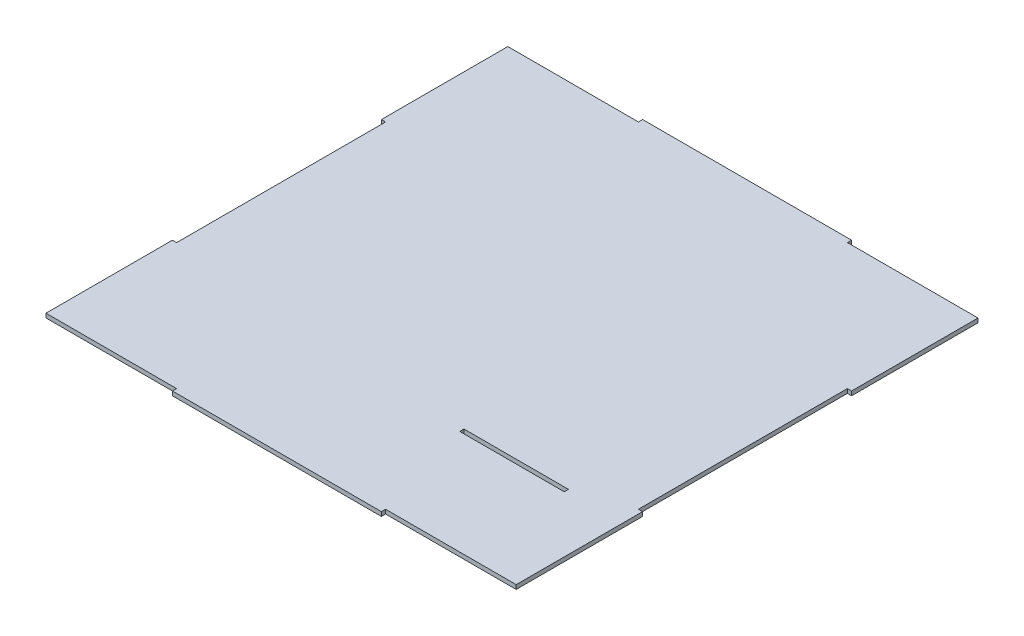
ISO-10303-21;
HEADER;
FILE_DESCRIPTION(('STEP AP214'),'2;1');
FILE_NAME('part.step','',(''),(''),'','','');
FILE_SCHEMA(('AUTOMOTIVE_DESIGN { 1 0 10303 214 1 1 1 1 }'));
ENDSEC;
DATA;
#1=APPLICATION_CONTEXT('core data for automotive mechanical design processes');
#2=APPLICATION_PROTOCOL_DEFINITION('international standard','automotive_design',2000,#1);
#3=PRODUCT_CONTEXT('',#1,'mechanical');
#4=PRODUCT('Part','Part','',(#3));
#5=PRODUCT_RELATED_PRODUCT_CATEGORY('part','',(#4));
#6=PRODUCT_DEFINITION_FORMATION('','',#4);
#7=PRODUCT_DEFINITION_CONTEXT('part definition',#1,'design');
#8=PRODUCT_DEFINITION('design','',#6,#7);
#9=PRODUCT_DEFINITION_SHAPE('','',#8);
#10=(LENGTH_UNIT() NAMED_UNIT(*) SI_UNIT(.MILLI.,.METRE.));
#11=(NAMED_UNIT(*) PLANE_ANGLE_UNIT() SI_UNIT($,.RADIAN.));
#12=(NAMED_UNIT(*) SI_UNIT($,.STERADIAN.) SOLID_ANGLE_UNIT());
#13=UNCERTAINTY_MEASURE_WITH_UNIT(LENGTH_MEASURE(1.E-05),#10,'distance_accuracy_value','');
#14=(GEOMETRIC_REPRESENTATION_CONTEXT(3) GLOBAL_UNCERTAINTY_ASSIGNED_CONTEXT((#13)) GLOBAL_UNIT_ASSIGNED_CONTEXT((#10,
#11,#12)) REPRESENTATION_CONTEXT('',''));
#15=CARTESIAN_POINT('',(0.,0.,0.));
#16=DIRECTION('',(0.,0.,1.));
#17=DIRECTION('',(1.,0.,0.));
#18=AXIS2_PLACEMENT_3D('',#15,#16,#17);
#19=CARTESIAN_POINT('',(0.,4.,117.));
#20=DIRECTION('',(0.,0.,-1.));
#21=DIRECTION('',(-1.,0.,0.));
#22=AXIS2_PLACEMENT_3D('',#19,#20,#21);
#23=PLANE('',#22);
#24=DIRECTION('',(1.,0.,0.));
#25=VECTOR('',#24,1.);
#26=CARTESIAN_POINT('',(0.,0.,117.));
#27=LINE('',#26,#25);
#28=CARTESIAN_POINT('',(71.,0.,117.));
#29=VERTEX_POINT('',#28);
#30=CARTESIAN_POINT('',(171.,0.,117.));
#31=VERTEX_POINT('',#30);
#32=EDGE_CURVE('E285',#29,#31,#27,.T.);
#33=ORIENTED_EDGE('',*,*,#32,.T.);
#34=DIRECTION('',(0.,-1.,0.));
#35=VECTOR('',#34,1.);
#36=CARTESIAN_POINT('',(171.,4.,117.));
#37=LINE('',#36,#35);
#38=CARTESIAN_POINT('',(171.,4.,117.));
#39=VERTEX_POINT('',#38);
#40=EDGE_CURVE('E11',#39,#31,#37,.T.);
#41=ORIENTED_EDGE('',*,*,#40,.F.);
#42=DIRECTION('',(1.,0.,0.));
#43=VECTOR('',#42,1.);
#44=CARTESIAN_POINT('',(0.,4.,117.));
#45=LINE('',#44,#43);
#46=CARTESIAN_POINT('',(71.,4.,117.));
#47=VERTEX_POINT('',#46);
#48=EDGE_CURVE('E215',#47,#39,#45,.T.);
#49=ORIENTED_EDGE('',*,*,#48,.F.);
#50=DIRECTION('',(0.,-1.,0.));
#51=VECTOR('',#50,1.);
#52=CARTESIAN_POINT('',(71.,4.,117.));
#53=LINE('',#52,#51);
#54=EDGE_CURVE('E59',#47,#29,#53,.T.);
#55=ORIENTED_EDGE('',*,*,#54,.T.);
#56=EDGE_LOOP('',(#33,#41,#49,#55));
#57=FACE_BOUND('',#56,.T.);
#58=ADVANCED_FACE('F40',(#57),#23,.F.);
#59=CARTESIAN_POINT('',(171.,4.,0.));
#60=DIRECTION('',(1.,0.,0.));
#61=DIRECTION('',(0.,0.,-1.));
#62=AXIS2_PLACEMENT_3D('',#59,#60,#61);
#63=PLANE('',#62);
#64=DIRECTION('',(0.,0.,1.));
#65=VECTOR('',#64,1.);
#66=CARTESIAN_POINT('',(171.,0.,0.));
#67=LINE('',#66,#65);
#68=CARTESIAN_POINT('',(171.,0.,121.));
#69=VERTEX_POINT('',#68);
#70=EDGE_CURVE('E221',#31,#69,#67,.T.);
#71=ORIENTED_EDGE('',*,*,#70,.T.);
#72=DIRECTION('',(0.,-1.,0.));
#73=VECTOR('',#72,1.);
#74=CARTESIAN_POINT('',(171.,4.,121.));
#75=LINE('',#74,#73);
#76=CARTESIAN_POINT('',(171.,4.,121.));
#77=VERTEX_POINT('',#76);
#78=EDGE_CURVE('E50',#77,#69,#75,.T.);
#79=ORIENTED_EDGE('',*,*,#78,.F.);
#80=DIRECTION('',(0.,0.,1.));
#81=VECTOR('',#80,1.);
#82=CARTESIAN_POINT('',(171.,4.,0.));
#83=LINE('',#82,#81);
#84=EDGE_CURVE('E209',#39,#77,#83,.T.);
#85=ORIENTED_EDGE('',*,*,#84,.F.);
#86=ORIENTED_EDGE('',*,*,#40,.T.);
#87=EDGE_LOOP('',(#71,#79,#85,#86));
#88=FACE_BOUND('',#87,.T.);
#89=ADVANCED_FACE('F220',(#88),#63,.F.);
#90=CARTESIAN_POINT('',(0.,4.,121.));
#91=DIRECTION('',(0.,0.,-1.));
#92=DIRECTION('',(-1.,0.,0.));
#93=AXIS2_PLACEMENT_3D('',#90,#91,#92);
#94=PLANE('',#93);
#95=DIRECTION('',(1.,0.,0.));
#96=VECTOR('',#95,1.);
#97=CARTESIAN_POINT('',(0.,0.,121.));
#98=LINE('',#97,#96);
#99=CARTESIAN_POINT('',(71.,0.,121.));
#100=VERTEX_POINT('',#99);
#101=EDGE_CURVE('E288',#100,#69,#98,.T.);
#102=ORIENTED_EDGE('',*,*,#101,.F.);
#103=DIRECTION('',(0.,-1.,0.));
#104=VECTOR('',#103,1.);
#105=CARTESIAN_POINT('',(71.,4.,121.));
#106=LINE('',#105,#104);
#107=CARTESIAN_POINT('',(71.,4.,121.));
#108=VERTEX_POINT('',#107);
#109=EDGE_CURVE('E133',#108,#100,#106,.T.);
#110=ORIENTED_EDGE('',*,*,#109,.F.);
#111=DIRECTION('',(1.,0.,0.));
#112=VECTOR('',#111,1.);
#113=CARTESIAN_POINT('',(0.,4.,121.));
#114=LINE('',#113,#112);
#115=EDGE_CURVE('E214',#108,#77,#114,.T.);
#116=ORIENTED_EDGE('',*,*,#115,.T.);
#117=ORIENTED_EDGE('',*,*,#78,.T.);
#118=EDGE_LOOP('',(#102,#110,#116,#117));
#119=FACE_BOUND('',#118,.T.);
#120=ADVANCED_FACE('F225',(#119),#94,.T.);
#121=CARTESIAN_POINT('',(0.,4.,221.));
#122=DIRECTION('',(0.,0.,1.));
#123=DIRECTION('',(1.,0.,0.));
#124=AXIS2_PLACEMENT_3D('',#121,#122,#123);
#125=PLANE('',#124);
#126=DIRECTION('',(-1.,0.,0.));
#127=VECTOR('',#126,1.);
#128=CARTESIAN_POINT('',(0.,0.,221.));
#129=LINE('',#128,#127);
#130=CARTESIAN_POINT('',(-100.,0.,221.));
#131=VERTEX_POINT('',#130);
#132=CARTESIAN_POINT('',(-225.,0.,221.));
#133=VERTEX_POINT('',#132);
#134=EDGE_CURVE('E232',#131,#133,#129,.T.);
#135=ORIENTED_EDGE('',*,*,#134,.F.);
#136=DIRECTION('',(0.,-1.,0.));
#137=VECTOR('',#136,1.);
#138=CARTESIAN_POINT('',(-100.,4.,221.));
#139=LINE('',#138,#137);
#140=CARTESIAN_POINT('',(-100.,4.,221.));
#141=VERTEX_POINT('',#140);
#142=EDGE_CURVE('E44',#141,#131,#139,.T.);
#143=ORIENTED_EDGE('',*,*,#142,.F.);
#144=DIRECTION('',(-1.,0.,0.));
#145=VECTOR('',#144,1.);
#146=CARTESIAN_POINT('',(0.,4.,221.));
#147=LINE('',#146,#145);
#148=CARTESIAN_POINT('',(-225.,4.,221.));
#149=VERTEX_POINT('',#148);
#150=EDGE_CURVE('E293',#141,#149,#147,.T.);
#151=ORIENTED_EDGE('',*,*,#150,.T.);
#152=DIRECTION('',(0.,-1.,0.));
#153=VECTOR('',#152,1.);
#154=CARTESIAN_POINT('',(-225.,4.,221.));
#155=LINE('',#154,#153);
#156=EDGE_CURVE('E228',#149,#133,#155,.T.);
#157=ORIENTED_EDGE('',*,*,#156,.T.);
#158=EDGE_LOOP('',(#135,#143,#151,#157));
#159=FACE_BOUND('',#158,.T.);
#160=ADVANCED_FACE('F42',(#159),#125,.T.);
#161=CARTESIAN_POINT('',(-100.,4.,0.));
#162=DIRECTION('',(-1.,0.,0.));
#163=DIRECTION('',(0.,0.,1.));
#164=AXIS2_PLACEMENT_3D('',#161,#162,#163);
#165=PLANE('',#164);
#166=DIRECTION('',(0.,0.,-1.));
#167=VECTOR('',#166,1.);
#168=CARTESIAN_POINT('',(-100.,0.,0.));
#169=LINE('',#168,#167);
#170=CARTESIAN_POINT('',(-100.,0.,225.));
#171=VERTEX_POINT('',#170);
#172=EDGE_CURVE('E235',#171,#131,#169,.T.);
#173=ORIENTED_EDGE('',*,*,#172,.F.);
#174=DIRECTION('',(0.,-1.,0.));
#175=VECTOR('',#174,1.);
#176=CARTESIAN_POINT('',(-100.,4.,225.));
#177=LINE('',#176,#175);
#178=CARTESIAN_POINT('',(-100.,4.,225.));
#179=VERTEX_POINT('',#178);
#180=EDGE_CURVE('E337',#179,#171,#177,.T.);
#181=ORIENTED_EDGE('',*,*,#180,.F.);
#182=DIRECTION('',(0.,0.,-1.));
#183=VECTOR('',#182,1.);
#184=CARTESIAN_POINT('',(-100.,4.,0.));
#185=LINE('',#184,#183);
#186=EDGE_CURVE('E346',#179,#141,#185,.T.);
#187=ORIENTED_EDGE('',*,*,#186,.T.);
#188=ORIENTED_EDGE('',*,*,#142,.T.);
#189=EDGE_LOOP('',(#173,#181,#187,#188));
#190=FACE_BOUND('',#189,.T.);
#191=ADVANCED_FACE('F344',(#190),#165,.T.);
#192=CARTESIAN_POINT('',(0.,4.,225.));
#193=DIRECTION('',(0.,0.,-1.));
#194=DIRECTION('',(-1.,0.,0.));
#195=AXIS2_PLACEMENT_3D('',#192,#193,#194);
#196=PLANE('',#195);
#197=DIRECTION('',(1.,0.,0.));
#198=VECTOR('',#197,1.);
#199=CARTESIAN_POINT('',(0.,0.,225.));
#200=LINE('',#199,#198);
#201=CARTESIAN_POINT('',(100.,0.,225.));
#202=VERTEX_POINT('',#201);
#203=EDGE_CURVE('E238',#171,#202,#200,.T.);
#204=ORIENTED_EDGE('',*,*,#203,.T.);
#205=DIRECTION('',(0.,-1.,0.));
#206=VECTOR('',#205,1.);
#207=CARTESIAN_POINT('',(100.,4.,225.));
#208=LINE('',#207,#206);
#209=CARTESIAN_POINT('',(100.,4.,225.));
#210=VERTEX_POINT('',#209);
#211=EDGE_CURVE('E335',#210,#202,#208,.T.);
#212=ORIENTED_EDGE('',*,*,#211,.F.);
#213=DIRECTION('',(1.,0.,0.));
#214=VECTOR('',#213,1.);
#215=CARTESIAN_POINT('',(0.,4.,225.));
#216=LINE('',#215,#214);
#217=EDGE_CURVE('E363',#179,#210,#216,.T.);
#218=ORIENTED_EDGE('',*,*,#217,.F.);
#219=ORIENTED_EDGE('',*,*,#180,.T.);
#220=EDGE_LOOP('',(#204,#212,#218,#219));
#221=FACE_BOUND('',#220,.T.);
#222=ADVANCED_FACE('F354',(#221),#196,.F.);
#223=CARTESIAN_POINT('',(100.,4.,0.));
#224=DIRECTION('',(-1.,0.,0.));
#225=DIRECTION('',(0.,0.,1.));
#226=AXIS2_PLACEMENT_3D('',#223,#224,#225);
#227=PLANE('',#226);
#228=DIRECTION('',(0.,0.,-1.));
#229=VECTOR('',#228,1.);
#230=CARTESIAN_POINT('',(100.,0.,0.));
#231=LINE('',#230,#229);
#232=CARTESIAN_POINT('',(100.,0.,221.));
#233=VERTEX_POINT('',#232);
#234=EDGE_CURVE('E240',#202,#233,#231,.T.);
#235=ORIENTED_EDGE('',*,*,#234,.T.);
#236=DIRECTION('',(0.,-1.,0.));
#237=VECTOR('',#236,1.);
#238=CARTESIAN_POINT('',(100.,4.,221.));
#239=LINE('',#238,#237);
#240=CARTESIAN_POINT('',(100.,4.,221.));
#241=VERTEX_POINT('',#240);
#242=EDGE_CURVE('E332',#241,#233,#239,.T.);
#243=ORIENTED_EDGE('',*,*,#242,.F.);
#244=DIRECTION('',(0.,0.,-1.));
#245=VECTOR('',#244,1.);
#246=CARTESIAN_POINT('',(100.,4.,0.));
#247=LINE('',#246,#245);
#248=EDGE_CURVE('E359',#210,#241,#247,.T.);
#249=ORIENTED_EDGE('',*,*,#248,.F.);
#250=ORIENTED_EDGE('',*,*,#211,.T.);
#251=EDGE_LOOP('',(#235,#243,#249,#250));
#252=FACE_BOUND('',#251,.T.);
#253=ADVANCED_FACE('F357',(#252),#227,.F.);
#254=CARTESIAN_POINT('',(0.,4.,221.));
#255=DIRECTION('',(0.,0.,-1.));
#256=DIRECTION('',(-1.,0.,0.));
#257=AXIS2_PLACEMENT_3D('',#254,#255,#256);
#258=PLANE('',#257);
#259=DIRECTION('',(1.,0.,0.));
#260=VECTOR('',#259,1.);
#261=CARTESIAN_POINT('',(0.,0.,221.));
#262=LINE('',#261,#260);
#263=CARTESIAN_POINT('',(225.,0.,221.));
#264=VERTEX_POINT('',#263);
#265=EDGE_CURVE('E242',#233,#264,#262,.T.);
#266=ORIENTED_EDGE('',*,*,#265,.T.);
#267=DIRECTION('',(0.,-1.,0.));
#268=VECTOR('',#267,1.);
#269=CARTESIAN_POINT('',(225.,4.,221.));
#270=LINE('',#269,#268);
#271=CARTESIAN_POINT('',(225.,4.,221.));
#272=VERTEX_POINT('',#271);
#273=EDGE_CURVE('E329',#272,#264,#270,.T.);
#274=ORIENTED_EDGE('',*,*,#273,.F.);
#275=DIRECTION('',(1.,0.,0.));
#276=VECTOR('',#275,1.);
#277=CARTESIAN_POINT('',(0.,4.,221.));
#278=LINE('',#277,#276);
#279=EDGE_CURVE('E362',#241,#272,#278,.T.);
#280=ORIENTED_EDGE('',*,*,#279,.F.);
#281=ORIENTED_EDGE('',*,*,#242,.T.);
#282=EDGE_LOOP('',(#266,#274,#280,#281));
#283=FACE_BOUND('',#282,.T.);
#284=ADVANCED_FACE('F474',(#283),#258,.F.);
#285=CARTESIAN_POINT('',(225.,4.,0.));
#286=DIRECTION('',(-1.,0.,0.));
#287=DIRECTION('',(0.,0.,1.));
#288=AXIS2_PLACEMENT_3D('',#285,#286,#287);
#289=PLANE('',#288);
#290=DIRECTION('',(0.,0.,-1.));
#291=VECTOR('',#290,1.);
#292=CARTESIAN_POINT('',(225.,0.,0.));
#293=LINE('',#292,#291);
#294=CARTESIAN_POINT('',(225.,0.,100.));
#295=VERTEX_POINT('',#294);
#296=EDGE_CURVE('E244',#264,#295,#293,.T.);
#297=ORIENTED_EDGE('',*,*,#296,.T.);
#298=DIRECTION('',(0.,-1.,0.));
#299=VECTOR('',#298,1.);
#300=CARTESIAN_POINT('',(225.,4.,100.));
#301=LINE('',#300,#299);
#302=CARTESIAN_POINT('',(225.,4.,100.));
#303=VERTEX_POINT('',#302);
#304=EDGE_CURVE('E326',#303,#295,#301,.T.);
#305=ORIENTED_EDGE('',*,*,#304,.F.);
#306=DIRECTION('',(0.,0.,-1.));
#307=VECTOR('',#306,1.);
#308=CARTESIAN_POINT('',(225.,4.,0.));
#309=LINE('',#308,#307);
#310=EDGE_CURVE('E365',#272,#303,#309,.T.);
#311=ORIENTED_EDGE('',*,*,#310,.F.);
#312=ORIENTED_EDGE('',*,*,#273,.T.);
#313=EDGE_LOOP('',(#297,#305,#311,#312));
#314=FACE_BOUND('',#313,.T.);
#315=ADVANCED_FACE('F471',(#314),#289,.F.);
#316=CARTESIAN_POINT('',(0.,4.,100.));
#317=DIRECTION('',(0.,0.,1.));
#318=DIRECTION('',(1.,0.,0.));
#319=AXIS2_PLACEMENT_3D('',#316,#317,#318);
#320=PLANE('',#319);
#321=DIRECTION('',(-1.,0.,0.));
#322=VECTOR('',#321,1.);
#323=CARTESIAN_POINT('',(0.,0.,100.));
#324=LINE('',#323,#322);
#325=CARTESIAN_POINT('',(221.,0.,100.));
#326=VERTEX_POINT('',#325);
#327=EDGE_CURVE('E246',#295,#326,#324,.T.);
#328=ORIENTED_EDGE('',*,*,#327,.T.);
#329=DIRECTION('',(0.,-1.,0.));
#330=VECTOR('',#329,1.);
#331=CARTESIAN_POINT('',(221.,4.,100.));
#332=LINE('',#331,#330);
#333=CARTESIAN_POINT('',(221.,4.,100.));
#334=VERTEX_POINT('',#333);
#335=EDGE_CURVE('E323',#334,#326,#332,.T.);
#336=ORIENTED_EDGE('',*,*,#335,.F.);
#337=DIRECTION('',(-1.,0.,0.));
#338=VECTOR('',#337,1.);
#339=CARTESIAN_POINT('',(0.,4.,100.));
#340=LINE('',#339,#338);
#341=EDGE_CURVE('E371',#303,#334,#340,.T.);
#342=ORIENTED_EDGE('',*,*,#341,.F.);
#343=ORIENTED_EDGE('',*,*,#304,.T.);
#344=EDGE_LOOP('',(#328,#336,#342,#343));
#345=FACE_BOUND('',#344,.T.);
#346=ADVANCED_FACE('F466',(#345),#320,.F.);
#347=CARTESIAN_POINT('',(221.,4.,0.));
#348=DIRECTION('',(-1.,0.,0.));
#349=DIRECTION('',(0.,0.,1.));
#350=AXIS2_PLACEMENT_3D('',#347,#348,#349);
#351=PLANE('',#350);
#352=DIRECTION('',(0.,0.,-1.));
#353=VECTOR('',#352,1.);
#354=CARTESIAN_POINT('',(221.,0.,0.));
#355=LINE('',#354,#353);
#356=CARTESIAN_POINT('',(221.,0.,-100.));
#357=VERTEX_POINT('',#356);
#358=EDGE_CURVE('E248',#326,#357,#355,.T.);
#359=ORIENTED_EDGE('',*,*,#358,.T.);
#360=DIRECTION('',(0.,-1.,0.));
#361=VECTOR('',#360,1.);
#362=CARTESIAN_POINT('',(221.,4.,-100.));
#363=LINE('',#362,#361);
#364=CARTESIAN_POINT('',(221.,4.,-100.));
#365=VERTEX_POINT('',#364);
#366=EDGE_CURVE('E321',#365,#357,#363,.T.);
#367=ORIENTED_EDGE('',*,*,#366,.F.);
#368=DIRECTION('',(0.,0.,-1.));
#369=VECTOR('',#368,1.);
#370=CARTESIAN_POINT('',(221.,4.,0.));
#371=LINE('',#370,#369);
#372=EDGE_CURVE('E373',#334,#365,#371,.T.);
#373=ORIENTED_EDGE('',*,*,#372,.F.);
#374=ORIENTED_EDGE('',*,*,#335,.T.);
#375=EDGE_LOOP('',(#359,#367,#373,#374));
#376=FACE_BOUND('',#375,.T.);
#377=ADVANCED_FACE('F461',(#376),#351,.F.);
#378=CARTESIAN_POINT('',(0.,4.,-100.));
#379=DIRECTION('',(0.,0.,1.));
#380=DIRECTION('',(1.,0.,0.));
#381=AXIS2_PLACEMENT_3D('',#378,#379,#380);
#382=PLANE('',#381);
#383=DIRECTION('',(-1.,0.,0.));
#384=VECTOR('',#383,1.);
#385=CARTESIAN_POINT('',(0.,0.,-100.));
#386=LINE('',#385,#384);
#387=CARTESIAN_POINT('',(225.,0.,-100.));
#388=VERTEX_POINT('',#387);
#389=EDGE_CURVE('E251',#388,#357,#386,.T.);
#390=ORIENTED_EDGE('',*,*,#389,.F.);
#391=DIRECTION('',(0.,-1.,0.));
#392=VECTOR('',#391,1.);
#393=CARTESIAN_POINT('',(225.,4.,-100.));
#394=LINE('',#393,#392);
#395=CARTESIAN_POINT('',(225.,4.,-100.));
#396=VERTEX_POINT('',#395);
#397=EDGE_CURVE('E319',#396,#388,#394,.T.);
#398=ORIENTED_EDGE('',*,*,#397,.F.);
#399=DIRECTION('',(-1.,0.,0.));
#400=VECTOR('',#399,1.);
#401=CARTESIAN_POINT('',(0.,4.,-100.));
#402=LINE('',#401,#400);
#403=EDGE_CURVE('E375',#396,#365,#402,.T.);
#404=ORIENTED_EDGE('',*,*,#403,.T.);
#405=ORIENTED_EDGE('',*,*,#366,.T.);
#406=EDGE_LOOP('',(#390,#398,#404,#405));
#407=FACE_BOUND('',#406,.T.);
#408=ADVANCED_FACE('F456',(#407),#382,.T.);
#409=CARTESIAN_POINT('',(225.,4.,0.));
#410=DIRECTION('',(-1.,0.,0.));
#411=DIRECTION('',(0.,0.,1.));
#412=AXIS2_PLACEMENT_3D('',#409,#410,#411);
#413=PLANE('',#412);
#414=DIRECTION('',(0.,0.,-1.));
#415=VECTOR('',#414,1.);
#416=CARTESIAN_POINT('',(225.,0.,0.));
#417=LINE('',#416,#415);
#418=CARTESIAN_POINT('',(225.,0.,-221.));
#419=VERTEX_POINT('',#418);
#420=EDGE_CURVE('E254',#388,#419,#417,.T.);
#421=ORIENTED_EDGE('',*,*,#420,.T.);
#422=DIRECTION('',(0.,-1.,0.));
#423=VECTOR('',#422,1.);
#424=CARTESIAN_POINT('',(225.,4.,-221.));
#425=LINE('',#424,#423);
#426=CARTESIAN_POINT('',(225.,4.,-221.));
#427=VERTEX_POINT('',#426);
#428=EDGE_CURVE('E317',#427,#419,#425,.T.);
#429=ORIENTED_EDGE('',*,*,#428,.F.);
#430=DIRECTION('',(0.,0.,-1.));
#431=VECTOR('',#430,1.);
#432=CARTESIAN_POINT('',(225.,4.,0.));
#433=LINE('',#432,#431);
#434=EDGE_CURVE('E378',#396,#427,#433,.T.);
#435=ORIENTED_EDGE('',*,*,#434,.F.);
#436=ORIENTED_EDGE('',*,*,#397,.T.);
#437=EDGE_LOOP('',(#421,#429,#435,#436));
#438=FACE_BOUND('',#437,.T.);
#439=ADVANCED_FACE('F452',(#438),#413,.F.);
#440=CARTESIAN_POINT('',(0.,4.,-221.));
#441=DIRECTION('',(0.,0.,-1.));
#442=DIRECTION('',(-1.,0.,0.));
#443=AXIS2_PLACEMENT_3D('',#440,#441,#442);
#444=PLANE('',#443);
#445=DIRECTION('',(1.,0.,0.));
#446=VECTOR('',#445,1.);
#447=CARTESIAN_POINT('',(0.,0.,-221.));
#448=LINE('',#447,#446);
#449=CARTESIAN_POINT('',(99.9999999999999,0.,-221.));
#450=VERTEX_POINT('',#449);
#451=EDGE_CURVE('E257',#450,#419,#448,.T.);
#452=ORIENTED_EDGE('',*,*,#451,.F.);
#453=DIRECTION('',(0.,-1.,0.));
#454=VECTOR('',#453,1.);
#455=CARTESIAN_POINT('',(99.9999999999999,4.,-221.));
#456=LINE('',#455,#454);
#457=CARTESIAN_POINT('',(99.9999999999999,4.,-221.));
#458=VERTEX_POINT('',#457);
#459=EDGE_CURVE('E315',#458,#450,#456,.T.);
#460=ORIENTED_EDGE('',*,*,#459,.F.);
#461=DIRECTION('',(1.,0.,0.));
#462=VECTOR('',#461,1.);
#463=CARTESIAN_POINT('',(0.,4.,-221.));
#464=LINE('',#463,#462);
#465=EDGE_CURVE('E380',#458,#427,#464,.T.);
#466=ORIENTED_EDGE('',*,*,#465,.T.);
#467=ORIENTED_EDGE('',*,*,#428,.T.);
#468=EDGE_LOOP('',(#452,#460,#466,#467));
#469=FACE_BOUND('',#468,.T.);
#470=ADVANCED_FACE('F448',(#469),#444,.T.);
#471=CARTESIAN_POINT('',(99.9999999999999,4.,0.));
#472=DIRECTION('',(1.,0.,0.));
#473=DIRECTION('',(0.,0.,-1.));
#474=AXIS2_PLACEMENT_3D('',#471,#472,#473);
#475=PLANE('',#474);
#476=DIRECTION('',(0.,0.,1.));
#477=VECTOR('',#476,1.);
#478=CARTESIAN_POINT('',(99.9999999999999,0.,0.));
#479=LINE('',#478,#477);
#480=CARTESIAN_POINT('',(99.9999999999999,0.,-225.));
#481=VERTEX_POINT('',#480);
#482=EDGE_CURVE('E260',#481,#450,#479,.T.);
#483=ORIENTED_EDGE('',*,*,#482,.F.);
#484=DIRECTION('',(0.,-1.,0.));
#485=VECTOR('',#484,1.);
#486=CARTESIAN_POINT('',(99.9999999999999,4.,-225.));
#487=LINE('',#486,#485);
#488=CARTESIAN_POINT('',(99.9999999999999,4.,-225.));
#489=VERTEX_POINT('',#488);
#490=EDGE_CURVE('E313',#489,#481,#487,.T.);
#491=ORIENTED_EDGE('',*,*,#490,.F.);
#492=DIRECTION('',(0.,0.,1.));
#493=VECTOR('',#492,1.);
#494=CARTESIAN_POINT('',(99.9999999999999,4.,0.));
#495=LINE('',#494,#493);
#496=EDGE_CURVE('E383',#489,#458,#495,.T.);
#497=ORIENTED_EDGE('',*,*,#496,.T.);
#498=ORIENTED_EDGE('',*,*,#459,.T.);
#499=EDGE_LOOP('',(#483,#491,#497,#498));
#500=FACE_BOUND('',#499,.T.);
#501=ADVANCED_FACE('F444',(#500),#475,.T.);
#502=CARTESIAN_POINT('',(0.,4.,-225.));
#503=DIRECTION('',(0.,0.,-1.));
#504=DIRECTION('',(-1.,0.,0.));
#505=AXIS2_PLACEMENT_3D('',#502,#503,#504);
#506=PLANE('',#505);
#507=DIRECTION('',(1.,0.,0.));
#508=VECTOR('',#507,1.);
#509=CARTESIAN_POINT('',(0.,0.,-225.));
#510=LINE('',#509,#508);
#511=CARTESIAN_POINT('',(-100.,0.,-225.));
#512=VERTEX_POINT('',#511);
#513=EDGE_CURVE('E263',#512,#481,#510,.T.);
#514=ORIENTED_EDGE('',*,*,#513,.F.);
#515=DIRECTION('',(0.,-1.,0.));
#516=VECTOR('',#515,1.);
#517=CARTESIAN_POINT('',(-100.,4.,-225.));
#518=LINE('',#517,#516);
#519=CARTESIAN_POINT('',(-100.,4.,-225.));
#520=VERTEX_POINT('',#519);
#521=EDGE_CURVE('E311',#520,#512,#518,.T.);
#522=ORIENTED_EDGE('',*,*,#521,.F.);
#523=DIRECTION('',(1.,0.,0.));
#524=VECTOR('',#523,1.);
#525=CARTESIAN_POINT('',(0.,4.,-225.));
#526=LINE('',#525,#524);
#527=EDGE_CURVE('E386',#520,#489,#526,.T.);
#528=ORIENTED_EDGE('',*,*,#527,.T.);
#529=ORIENTED_EDGE('',*,*,#490,.T.);
#530=EDGE_LOOP('',(#514,#522,#528,#529));
#531=FACE_BOUND('',#530,.T.);
#532=ADVANCED_FACE('F439',(#531),#506,.T.);
#533=CARTESIAN_POINT('',(-100.,4.,0.));
#534=DIRECTION('',(1.,0.,0.));
#535=DIRECTION('',(0.,0.,-1.));
#536=AXIS2_PLACEMENT_3D('',#533,#534,#535);
#537=PLANE('',#536);
#538=DIRECTION('',(0.,0.,1.));
#539=VECTOR('',#538,1.);
#540=CARTESIAN_POINT('',(-100.,0.,0.));
#541=LINE('',#540,#539);
#542=CARTESIAN_POINT('',(-100.,0.,-221.));
#543=VERTEX_POINT('',#542);
#544=EDGE_CURVE('E266',#512,#543,#541,.T.);
#545=ORIENTED_EDGE('',*,*,#544,.T.);
#546=DIRECTION('',(0.,-1.,0.));
#547=VECTOR('',#546,1.);
#548=CARTESIAN_POINT('',(-100.,4.,-221.));
#549=LINE('',#548,#547);
#550=CARTESIAN_POINT('',(-100.,4.,-221.));
#551=VERTEX_POINT('',#550);
#552=EDGE_CURVE('E308',#551,#543,#549,.T.);
#553=ORIENTED_EDGE('',*,*,#552,.F.);
#554=DIRECTION('',(0.,0.,1.));
#555=VECTOR('',#554,1.);
#556=CARTESIAN_POINT('',(-100.,4.,0.));
#557=LINE('',#556,#555);
#558=EDGE_CURVE('E389',#520,#551,#557,.T.);
#559=ORIENTED_EDGE('',*,*,#558,.F.);
#560=ORIENTED_EDGE('',*,*,#521,.T.);
#561=EDGE_LOOP('',(#545,#553,#559,#560));
#562=FACE_BOUND('',#561,.T.);
#563=ADVANCED_FACE('F436',(#562),#537,.F.);
#564=CARTESIAN_POINT('',(0.,4.,-221.));
#565=DIRECTION('',(0.,0.,1.));
#566=DIRECTION('',(1.,0.,0.));
#567=AXIS2_PLACEMENT_3D('',#564,#565,#566);
#568=PLANE('',#567);
#569=DIRECTION('',(-1.,0.,0.));
#570=VECTOR('',#569,1.);
#571=CARTESIAN_POINT('',(0.,0.,-221.));
#572=LINE('',#571,#570);
#573=CARTESIAN_POINT('',(-225.,0.,-221.));
#574=VERTEX_POINT('',#573);
#575=EDGE_CURVE('E268',#543,#574,#572,.T.);
#576=ORIENTED_EDGE('',*,*,#575,.T.);
#577=DIRECTION('',(0.,-1.,0.));
#578=VECTOR('',#577,1.);
#579=CARTESIAN_POINT('',(-225.,4.,-221.));
#580=LINE('',#579,#578);
#581=CARTESIAN_POINT('',(-225.,4.,-221.));
#582=VERTEX_POINT('',#581);
#583=EDGE_CURVE('E306',#582,#574,#580,.T.);
#584=ORIENTED_EDGE('',*,*,#583,.F.);
#585=DIRECTION('',(-1.,0.,0.));
#586=VECTOR('',#585,1.);
#587=CARTESIAN_POINT('',(0.,4.,-221.));
#588=LINE('',#587,#586);
#589=EDGE_CURVE('E391',#551,#582,#588,.T.);
#590=ORIENTED_EDGE('',*,*,#589,.F.);
#591=ORIENTED_EDGE('',*,*,#552,.T.);
#592=EDGE_LOOP('',(#576,#584,#590,#591));
#593=FACE_BOUND('',#592,.T.);
#594=ADVANCED_FACE('F431',(#593),#568,.F.);
#595=CARTESIAN_POINT('',(-225.,4.,0.));
#596=DIRECTION('',(-1.,0.,0.));
#597=DIRECTION('',(0.,0.,1.));
#598=AXIS2_PLACEMENT_3D('',#595,#596,#597);
#599=PLANE('',#598);
#600=DIRECTION('',(0.,0.,-1.));
#601=VECTOR('',#600,1.);
#602=CARTESIAN_POINT('',(-225.,0.,0.));
#603=LINE('',#602,#601);
#604=CARTESIAN_POINT('',(-225.,0.,-100.));
#605=VERTEX_POINT('',#604);
#606=EDGE_CURVE('E271',#605,#574,#603,.T.);
#607=ORIENTED_EDGE('',*,*,#606,.F.);
#608=DIRECTION('',(0.,-1.,0.));
#609=VECTOR('',#608,1.);
#610=CARTESIAN_POINT('',(-225.,4.,-100.));
#611=LINE('',#610,#609);
#612=CARTESIAN_POINT('',(-225.,4.,-100.));
#613=VERTEX_POINT('',#612);
#614=EDGE_CURVE('E304',#613,#605,#611,.T.);
#615=ORIENTED_EDGE('',*,*,#614,.F.);
#616=DIRECTION('',(0.,0.,-1.));
#617=VECTOR('',#616,1.);
#618=CARTESIAN_POINT('',(-225.,4.,0.));
#619=LINE('',#618,#617);
#620=EDGE_CURVE('E393',#613,#582,#619,.T.);
#621=ORIENTED_EDGE('',*,*,#620,.T.);
#622=ORIENTED_EDGE('',*,*,#583,.T.);
#623=EDGE_LOOP('',(#607,#615,#621,#622));
#624=FACE_BOUND('',#623,.T.);
#625=ADVANCED_FACE('F425',(#624),#599,.T.);
#626=CARTESIAN_POINT('',(0.,4.,-100.));
#627=DIRECTION('',(0.,0.,-1.));
#628=DIRECTION('',(-1.,0.,0.));
#629=AXIS2_PLACEMENT_3D('',#626,#627,#628);
#630=PLANE('',#629);
#631=DIRECTION('',(1.,0.,0.));
#632=VECTOR('',#631,1.);
#633=CARTESIAN_POINT('',(0.,0.,-100.));
#634=LINE('',#633,#632);
#635=CARTESIAN_POINT('',(-221.,0.,-100.));
#636=VERTEX_POINT('',#635);
#637=EDGE_CURVE('E274',#605,#636,#634,.T.);
#638=ORIENTED_EDGE('',*,*,#637,.T.);
#639=DIRECTION('',(0.,-1.,0.));
#640=VECTOR('',#639,1.);
#641=CARTESIAN_POINT('',(-221.,4.,-100.));
#642=LINE('',#641,#640);
#643=CARTESIAN_POINT('',(-221.,4.,-100.));
#644=VERTEX_POINT('',#643);
#645=EDGE_CURVE('E301',#644,#636,#642,.T.);
#646=ORIENTED_EDGE('',*,*,#645,.F.);
#647=DIRECTION('',(1.,0.,0.));
#648=VECTOR('',#647,1.);
#649=CARTESIAN_POINT('',(0.,4.,-100.));
#650=LINE('',#649,#648);
#651=EDGE_CURVE('E396',#613,#644,#650,.T.);
#652=ORIENTED_EDGE('',*,*,#651,.F.);
#653=ORIENTED_EDGE('',*,*,#614,.T.);
#654=EDGE_LOOP('',(#638,#646,#652,#653));
#655=FACE_BOUND('',#654,.T.);
#656=ADVANCED_FACE('F422',(#655),#630,.F.);
#657=CARTESIAN_POINT('',(-221.,4.,0.));
#658=DIRECTION('',(1.,0.,0.));
#659=DIRECTION('',(0.,0.,-1.));
#660=AXIS2_PLACEMENT_3D('',#657,#658,#659);
#661=PLANE('',#660);
#662=DIRECTION('',(0.,0.,1.));
#663=VECTOR('',#662,1.);
#664=CARTESIAN_POINT('',(-221.,0.,0.));
#665=LINE('',#664,#663);
#666=CARTESIAN_POINT('',(-221.,0.,100.));
#667=VERTEX_POINT('',#666);
#668=EDGE_CURVE('E276',#636,#667,#665,.T.);
#669=ORIENTED_EDGE('',*,*,#668,.T.);
#670=DIRECTION('',(0.,-1.,0.));
#671=VECTOR('',#670,1.);
#672=CARTESIAN_POINT('',(-221.,4.,100.));
#673=LINE('',#672,#671);
#674=CARTESIAN_POINT('',(-221.,4.,100.));
#675=VERTEX_POINT('',#674);
#676=EDGE_CURVE('E299',#675,#667,#673,.T.);
#677=ORIENTED_EDGE('',*,*,#676,.F.);
#678=DIRECTION('',(0.,0.,1.));
#679=VECTOR('',#678,1.);
#680=CARTESIAN_POINT('',(-221.,4.,0.));
#681=LINE('',#680,#679);
#682=EDGE_CURVE('E398',#644,#675,#681,.T.);
#683=ORIENTED_EDGE('',*,*,#682,.F.);
#684=ORIENTED_EDGE('',*,*,#645,.T.);
#685=EDGE_LOOP('',(#669,#677,#683,#684));
#686=FACE_BOUND('',#685,.T.);
#687=ADVANCED_FACE('F418',(#686),#661,.F.);
#688=CARTESIAN_POINT('',(0.,4.,100.));
#689=DIRECTION('',(0.,0.,-1.));
#690=DIRECTION('',(-1.,0.,0.));
#691=AXIS2_PLACEMENT_3D('',#688,#689,#690);
#692=PLANE('',#691);
#693=DIRECTION('',(1.,0.,0.));
#694=VECTOR('',#693,1.);
#695=CARTESIAN_POINT('',(0.,0.,100.));
#696=LINE('',#695,#694);
#697=CARTESIAN_POINT('',(-225.,0.,100.));
#698=VERTEX_POINT('',#697);
#699=EDGE_CURVE('E279',#698,#667,#696,.T.);
#700=ORIENTED_EDGE('',*,*,#699,.F.);
#701=DIRECTION('',(0.,-1.,0.));
#702=VECTOR('',#701,1.);
#703=CARTESIAN_POINT('',(-225.,4.,100.));
#704=LINE('',#703,#702);
#705=CARTESIAN_POINT('',(-225.,4.,100.));
#706=VERTEX_POINT('',#705);
#707=EDGE_CURVE('E297',#706,#698,#704,.T.);
#708=ORIENTED_EDGE('',*,*,#707,.F.);
#709=DIRECTION('',(1.,0.,0.));
#710=VECTOR('',#709,1.);
#711=CARTESIAN_POINT('',(0.,4.,100.));
#712=LINE('',#711,#710);
#713=EDGE_CURVE('E400',#706,#675,#712,.T.);
#714=ORIENTED_EDGE('',*,*,#713,.T.);
#715=ORIENTED_EDGE('',*,*,#676,.T.);
#716=EDGE_LOOP('',(#700,#708,#714,#715));
#717=FACE_BOUND('',#716,.T.);
#718=ADVANCED_FACE('F413',(#717),#692,.T.);
#719=CARTESIAN_POINT('',(-225.,4.,0.));
#720=DIRECTION('',(-1.,0.,0.));
#721=DIRECTION('',(0.,0.,1.));
#722=AXIS2_PLACEMENT_3D('',#719,#720,#721);
#723=PLANE('',#722);
#724=DIRECTION('',(0.,0.,-1.));
#725=VECTOR('',#724,1.);
#726=CARTESIAN_POINT('',(-225.,0.,0.));
#727=LINE('',#726,#725);
#728=EDGE_CURVE('E282',#133,#698,#727,.T.);
#729=ORIENTED_EDGE('',*,*,#728,.F.);
#730=ORIENTED_EDGE('',*,*,#156,.F.);
#731=DIRECTION('',(0.,0.,-1.));
#732=VECTOR('',#731,1.);
#733=CARTESIAN_POINT('',(-225.,4.,0.));
#734=LINE('',#733,#732);
#735=EDGE_CURVE('E403',#149,#706,#734,.T.);
#736=ORIENTED_EDGE('',*,*,#735,.T.);
#737=ORIENTED_EDGE('',*,*,#707,.T.);
#738=EDGE_LOOP('',(#729,#730,#736,#737));
#739=FACE_BOUND('',#738,.T.);
#740=ADVANCED_FACE('F407',(#739),#723,.T.);
#741=CARTESIAN_POINT('',(71.,4.,0.));
#742=DIRECTION('',(1.,0.,0.));
#743=DIRECTION('',(0.,0.,-1.));
#744=AXIS2_PLACEMENT_3D('',#741,#742,#743);
#745=PLANE('',#744);
#746=DIRECTION('',(0.,0.,1.));
#747=VECTOR('',#746,1.);
#748=CARTESIAN_POINT('',(71.,0.,0.));
#749=LINE('',#748,#747);
#750=EDGE_CURVE('E290',#29,#100,#749,.T.);
#751=ORIENTED_EDGE('',*,*,#750,.F.);
#752=ORIENTED_EDGE('',*,*,#54,.F.);
#753=DIRECTION('',(0.,0.,1.));
#754=VECTOR('',#753,1.);
#755=CARTESIAN_POINT('',(71.,4.,0.));
#756=LINE('',#755,#754);
#757=EDGE_CURVE('E226',#47,#108,#756,.T.);
#758=ORIENTED_EDGE('',*,*,#757,.T.);
#759=ORIENTED_EDGE('',*,*,#109,.T.);
#760=EDGE_LOOP('',(#751,#752,#758,#759));
#761=FACE_BOUND('',#760,.T.);
#762=ADVANCED_FACE('F493',(#761),#745,.T.);
#763=CARTESIAN_POINT('',(0.,4.,0.));
#764=DIRECTION('',(0.,1.,0.));
#765=DIRECTION('',(0.,0.,1.));
#766=AXIS2_PLACEMENT_3D('',#763,#764,#765);
#767=PLANE('',#766);
#768=ORIENTED_EDGE('',*,*,#150,.F.);
#769=ORIENTED_EDGE('',*,*,#186,.F.);
#770=ORIENTED_EDGE('',*,*,#217,.T.);
#771=ORIENTED_EDGE('',*,*,#248,.T.);
#772=ORIENTED_EDGE('',*,*,#279,.T.);
#773=ORIENTED_EDGE('',*,*,#310,.T.);
#774=ORIENTED_EDGE('',*,*,#341,.T.);
#775=ORIENTED_EDGE('',*,*,#372,.T.);
#776=ORIENTED_EDGE('',*,*,#403,.F.);
#777=ORIENTED_EDGE('',*,*,#434,.T.);
#778=ORIENTED_EDGE('',*,*,#465,.F.);
#779=ORIENTED_EDGE('',*,*,#496,.F.);
#780=ORIENTED_EDGE('',*,*,#527,.F.);
#781=ORIENTED_EDGE('',*,*,#558,.T.);
#782=ORIENTED_EDGE('',*,*,#589,.T.);
#783=ORIENTED_EDGE('',*,*,#620,.F.);
#784=ORIENTED_EDGE('',*,*,#651,.T.);
#785=ORIENTED_EDGE('',*,*,#682,.T.);
#786=ORIENTED_EDGE('',*,*,#713,.F.);
#787=ORIENTED_EDGE('',*,*,#735,.F.);
#788=EDGE_LOOP('',(#768,#769,#770,#771,#772,#773,#774,#775,#776,#777,#778,#779,#780,#781,#782,
#783,#784,#785,#786,#787));
#789=FACE_BOUND('',#788,.T.);
#790=ORIENTED_EDGE('',*,*,#48,.T.);
#791=ORIENTED_EDGE('',*,*,#84,.T.);
#792=ORIENTED_EDGE('',*,*,#115,.F.);
#793=ORIENTED_EDGE('',*,*,#757,.F.);
#794=EDGE_LOOP('',(#790,#791,#792,#793));
#795=FACE_BOUND('',#794,.T.);
#796=ADVANCED_FACE('F211',(#789,#795),#767,.T.);
#797=CARTESIAN_POINT('',(0.,0.,0.));
#798=DIRECTION('',(0.,1.,0.));
#799=DIRECTION('',(0.,0.,1.));
#800=AXIS2_PLACEMENT_3D('',#797,#798,#799);
#801=PLANE('',#800);
#802=ORIENTED_EDGE('',*,*,#134,.T.);
#803=ORIENTED_EDGE('',*,*,#728,.T.);
#804=ORIENTED_EDGE('',*,*,#699,.T.);
#805=ORIENTED_EDGE('',*,*,#668,.F.);
#806=ORIENTED_EDGE('',*,*,#637,.F.);
#807=ORIENTED_EDGE('',*,*,#606,.T.);
#808=ORIENTED_EDGE('',*,*,#575,.F.);
#809=ORIENTED_EDGE('',*,*,#544,.F.);
#810=ORIENTED_EDGE('',*,*,#513,.T.);
#811=ORIENTED_EDGE('',*,*,#482,.T.);
#812=ORIENTED_EDGE('',*,*,#451,.T.);
#813=ORIENTED_EDGE('',*,*,#420,.F.);
#814=ORIENTED_EDGE('',*,*,#389,.T.);
#815=ORIENTED_EDGE('',*,*,#358,.F.);
#816=ORIENTED_EDGE('',*,*,#327,.F.);
#817=ORIENTED_EDGE('',*,*,#296,.F.);
#818=ORIENTED_EDGE('',*,*,#265,.F.);
#819=ORIENTED_EDGE('',*,*,#234,.F.);
#820=ORIENTED_EDGE('',*,*,#203,.F.);
#821=ORIENTED_EDGE('',*,*,#172,.T.);
#822=EDGE_LOOP('',(#802,#803,#804,#805,#806,#807,#808,#809,#810,#811,#812,#813,#814,#815,#816,
#817,#818,#819,#820,#821));
#823=FACE_BOUND('',#822,.T.);
#824=ORIENTED_EDGE('',*,*,#32,.F.);
#825=ORIENTED_EDGE('',*,*,#750,.T.);
#826=ORIENTED_EDGE('',*,*,#101,.T.);
#827=ORIENTED_EDGE('',*,*,#70,.F.);
#828=EDGE_LOOP('',(#824,#825,#826,#827));
#829=FACE_BOUND('',#828,.T.);
#830=ADVANCED_FACE('F349',(#823,#829),#801,.F.);
#831=CLOSED_SHELL('',(#58,#89,#120,#160,#191,#222,#253,#284,#315,#346,#377,#408,#439,#470,#501,
#532,#563,#594,#625,#656,#687,#718,#740,#762,#796,#830));
#832=MANIFOLD_SOLID_BREP('B2',#831);
#833=ADVANCED_BREP_SHAPE_REPRESENTATION('',(#18,#832),#14);
#834=SHAPE_DEFINITION_REPRESENTATION(#9,#833);
ENDSEC;
END-ISO-10303-21;
